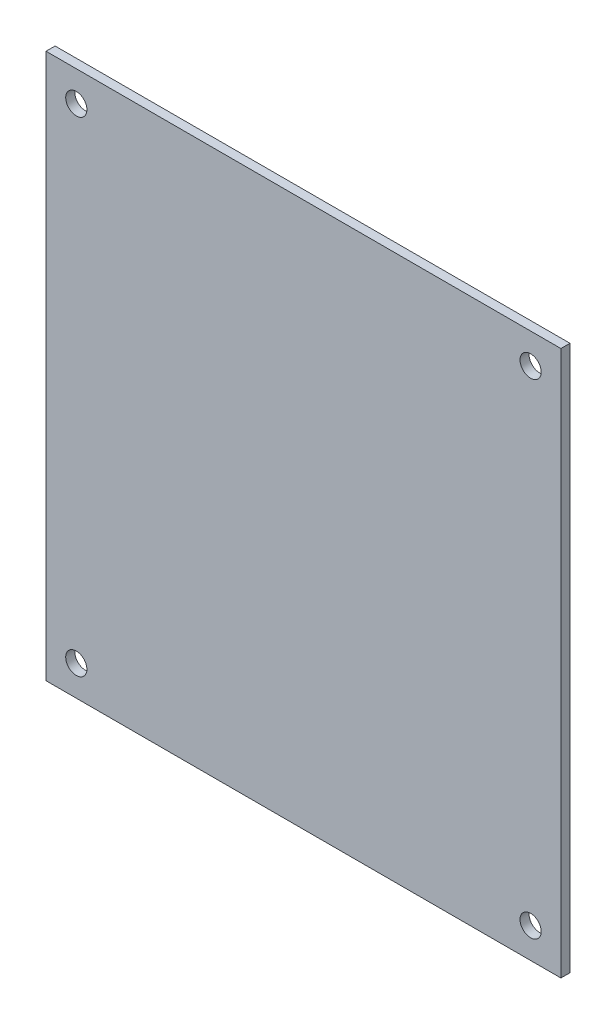
ISO-10303-21;
HEADER;
FILE_DESCRIPTION(('STEP AP214'),'2;1');
FILE_NAME('part.step','',(''),(''),'','','');
FILE_SCHEMA(('AUTOMOTIVE_DESIGN { 1 0 10303 214 1 1 1 1 }'));
ENDSEC;
DATA;
#1=APPLICATION_CONTEXT('core data for automotive mechanical design processes');
#2=APPLICATION_PROTOCOL_DEFINITION('international standard','automotive_design',2000,#1);
#3=PRODUCT_CONTEXT('',#1,'mechanical');
#4=PRODUCT('Part','Part','',(#3));
#5=PRODUCT_RELATED_PRODUCT_CATEGORY('part','',(#4));
#6=PRODUCT_DEFINITION_FORMATION('','',#4);
#7=PRODUCT_DEFINITION_CONTEXT('part definition',#1,'design');
#8=PRODUCT_DEFINITION('design','',#6,#7);
#9=PRODUCT_DEFINITION_SHAPE('','',#8);
#10=(LENGTH_UNIT() NAMED_UNIT(*) SI_UNIT(.MILLI.,.METRE.));
#11=(NAMED_UNIT(*) PLANE_ANGLE_UNIT() SI_UNIT($,.RADIAN.));
#12=(NAMED_UNIT(*) SI_UNIT($,.STERADIAN.) SOLID_ANGLE_UNIT());
#13=UNCERTAINTY_MEASURE_WITH_UNIT(LENGTH_MEASURE(1.E-05),#10,'distance_accuracy_value','');
#14=(GEOMETRIC_REPRESENTATION_CONTEXT(3) GLOBAL_UNCERTAINTY_ASSIGNED_CONTEXT((#13)) GLOBAL_UNIT_ASSIGNED_CONTEXT((#10,
#11,#12)) REPRESENTATION_CONTEXT('',''));
#15=CARTESIAN_POINT('',(0.,0.,0.));
#16=DIRECTION('',(0.,0.,1.));
#17=DIRECTION('',(1.,0.,0.));
#18=AXIS2_PLACEMENT_3D('',#15,#16,#17);
#19=CARTESIAN_POINT('',(0.,-45.,1.5));
#20=DIRECTION('',(0.,1.,0.));
#21=DIRECTION('',(0.,0.,1.));
#22=AXIS2_PLACEMENT_3D('',#19,#20,#21);
#23=PLANE('',#22);
#24=DIRECTION('',(1.,0.,0.));
#25=VECTOR('',#24,1.);
#26=CARTESIAN_POINT('',(0.,-45.,0.));
#27=LINE('',#26,#25);
#28=CARTESIAN_POINT('',(-42.5,-45.,0.));
#29=VERTEX_POINT('',#28);
#30=CARTESIAN_POINT('',(42.5,-45.,0.));
#31=VERTEX_POINT('',#30);
#32=EDGE_CURVE('E113',#29,#31,#27,.T.);
#33=ORIENTED_EDGE('',*,*,#32,.T.);
#34=DIRECTION('',(0.,0.,-1.));
#35=VECTOR('',#34,1.);
#36=CARTESIAN_POINT('',(42.5,-45.,1.5));
#37=LINE('',#36,#35);
#38=CARTESIAN_POINT('',(42.5,-45.,1.5));
#39=VERTEX_POINT('',#38);
#40=EDGE_CURVE('E11',#39,#31,#37,.T.);
#41=ORIENTED_EDGE('',*,*,#40,.F.);
#42=DIRECTION('',(1.,0.,0.));
#43=VECTOR('',#42,1.);
#44=CARTESIAN_POINT('',(0.,-45.,1.5));
#45=LINE('',#44,#43);
#46=CARTESIAN_POINT('',(-42.5,-45.,1.5));
#47=VERTEX_POINT('',#46);
#48=EDGE_CURVE('E87',#47,#39,#45,.T.);
#49=ORIENTED_EDGE('',*,*,#48,.F.);
#50=DIRECTION('',(0.,0.,-1.));
#51=VECTOR('',#50,1.);
#52=CARTESIAN_POINT('',(-42.5,-45.,1.5));
#53=LINE('',#52,#51);
#54=EDGE_CURVE('E54',#47,#29,#53,.T.);
#55=ORIENTED_EDGE('',*,*,#54,.T.);
#56=EDGE_LOOP('',(#33,#41,#49,#55));
#57=FACE_BOUND('',#56,.T.);
#58=ADVANCED_FACE('F37',(#57),#23,.F.);
#59=CARTESIAN_POINT('',(42.5,0.,1.5));
#60=DIRECTION('',(-1.,0.,0.));
#61=DIRECTION('',(0.,0.,1.));
#62=AXIS2_PLACEMENT_3D('',#59,#60,#61);
#63=PLANE('',#62);
#64=DIRECTION('',(0.,1.,0.));
#65=VECTOR('',#64,1.);
#66=CARTESIAN_POINT('',(42.5,0.,0.));
#67=LINE('',#66,#65);
#68=CARTESIAN_POINT('',(42.5,45.,0.));
#69=VERTEX_POINT('',#68);
#70=EDGE_CURVE('E92',#31,#69,#67,.T.);
#71=ORIENTED_EDGE('',*,*,#70,.T.);
#72=DIRECTION('',(0.,0.,-1.));
#73=VECTOR('',#72,1.);
#74=CARTESIAN_POINT('',(42.5,45.,1.5));
#75=LINE('',#74,#73);
#76=CARTESIAN_POINT('',(42.5,45.,1.5));
#77=VERTEX_POINT('',#76);
#78=EDGE_CURVE('E46',#77,#69,#75,.T.);
#79=ORIENTED_EDGE('',*,*,#78,.F.);
#80=DIRECTION('',(0.,1.,0.));
#81=VECTOR('',#80,1.);
#82=CARTESIAN_POINT('',(42.5,0.,1.5));
#83=LINE('',#82,#81);
#84=EDGE_CURVE('E79',#39,#77,#83,.T.);
#85=ORIENTED_EDGE('',*,*,#84,.F.);
#86=ORIENTED_EDGE('',*,*,#40,.T.);
#87=EDGE_LOOP('',(#71,#79,#85,#86));
#88=FACE_BOUND('',#87,.T.);
#89=ADVANCED_FACE('F91',(#88),#63,.F.);
#90=CARTESIAN_POINT('',(0.,45.,1.5));
#91=DIRECTION('',(0.,1.,0.));
#92=DIRECTION('',(0.,0.,1.));
#93=AXIS2_PLACEMENT_3D('',#90,#91,#92);
#94=PLANE('',#93);
#95=DIRECTION('',(1.,0.,0.));
#96=VECTOR('',#95,1.);
#97=CARTESIAN_POINT('',(0.,45.,0.));
#98=LINE('',#97,#96);
#99=CARTESIAN_POINT('',(-42.5,45.,0.));
#100=VERTEX_POINT('',#99);
#101=EDGE_CURVE('E116',#100,#69,#98,.T.);
#102=ORIENTED_EDGE('',*,*,#101,.F.);
#103=DIRECTION('',(0.,0.,-1.));
#104=VECTOR('',#103,1.);
#105=CARTESIAN_POINT('',(-42.5,45.,1.5));
#106=LINE('',#105,#104);
#107=CARTESIAN_POINT('',(-42.5,45.,1.5));
#108=VERTEX_POINT('',#107);
#109=EDGE_CURVE('E68',#108,#100,#106,.T.);
#110=ORIENTED_EDGE('',*,*,#109,.F.);
#111=DIRECTION('',(1.,0.,0.));
#112=VECTOR('',#111,1.);
#113=CARTESIAN_POINT('',(0.,45.,1.5));
#114=LINE('',#113,#112);
#115=EDGE_CURVE('E86',#108,#77,#114,.T.);
#116=ORIENTED_EDGE('',*,*,#115,.T.);
#117=ORIENTED_EDGE('',*,*,#78,.T.);
#118=EDGE_LOOP('',(#102,#110,#116,#117));
#119=FACE_BOUND('',#118,.T.);
#120=ADVANCED_FACE('F95',(#119),#94,.T.);
#121=CARTESIAN_POINT('',(-37.5,40.,1.5));
#122=DIRECTION('',(0.,0.,-1.));
#123=DIRECTION('',(-1.,0.,0.));
#124=AXIS2_PLACEMENT_3D('',#121,#122,#123);
#125=CYLINDRICAL_SURFACE('',#124,1.75);
#126=CARTESIAN_POINT('',(-37.5,40.,1.5));
#127=DIRECTION('',(0.,0.,1.));
#128=DIRECTION('',(1.,0.,0.));
#129=AXIS2_PLACEMENT_3D('',#126,#127,#128);
#130=CIRCLE('',#129,1.75);
#131=CARTESIAN_POINT('',(-35.75,40.,1.5));
#132=VERTEX_POINT('',#131);
#133=EDGE_CURVE('E135',#132,#132,#130,.T.);
#134=ORIENTED_EDGE('',*,*,#133,.T.);
#135=EDGE_LOOP('',(#134));
#136=FACE_BOUND('',#135,.T.);
#137=CARTESIAN_POINT('',(-37.5,40.,0.));
#138=DIRECTION('',(0.,0.,1.));
#139=DIRECTION('',(1.,0.,0.));
#140=AXIS2_PLACEMENT_3D('',#137,#138,#139);
#141=CIRCLE('',#140,1.75);
#142=CARTESIAN_POINT('',(-35.75,40.,0.));
#143=VERTEX_POINT('',#142);
#144=EDGE_CURVE('E110',#143,#143,#141,.T.);
#145=ORIENTED_EDGE('',*,*,#144,.F.);
#146=EDGE_LOOP('',(#145));
#147=FACE_BOUND('',#146,.T.);
#148=ADVANCED_FACE('F139',(#136,#147),#125,.F.);
#149=CARTESIAN_POINT('',(37.5,40.,1.5));
#150=DIRECTION('',(0.,0.,-1.));
#151=DIRECTION('',(-1.,0.,0.));
#152=AXIS2_PLACEMENT_3D('',#149,#150,#151);
#153=CYLINDRICAL_SURFACE('',#152,1.75000000000001);
#154=CARTESIAN_POINT('',(37.5,40.,1.5));
#155=DIRECTION('',(0.,0.,1.));
#156=DIRECTION('',(1.,0.,0.));
#157=AXIS2_PLACEMENT_3D('',#154,#155,#156);
#158=CIRCLE('',#157,1.75000000000001);
#159=CARTESIAN_POINT('',(39.25,40.,1.5));
#160=VERTEX_POINT('',#159);
#161=EDGE_CURVE('E130',#160,#160,#158,.T.);
#162=ORIENTED_EDGE('',*,*,#161,.T.);
#163=EDGE_LOOP('',(#162));
#164=FACE_BOUND('',#163,.T.);
#165=CARTESIAN_POINT('',(37.5,40.,0.));
#166=DIRECTION('',(0.,0.,1.));
#167=DIRECTION('',(1.,0.,0.));
#168=AXIS2_PLACEMENT_3D('',#165,#166,#167);
#169=CIRCLE('',#168,1.75000000000001);
#170=CARTESIAN_POINT('',(39.25,40.,0.));
#171=VERTEX_POINT('',#170);
#172=EDGE_CURVE('E107',#171,#171,#169,.T.);
#173=ORIENTED_EDGE('',*,*,#172,.F.);
#174=EDGE_LOOP('',(#173));
#175=FACE_BOUND('',#174,.T.);
#176=ADVANCED_FACE('F165',(#164,#175),#153,.F.);
#177=CARTESIAN_POINT('',(37.5,-40.,1.5));
#178=DIRECTION('',(0.,0.,-1.));
#179=DIRECTION('',(-1.,0.,0.));
#180=AXIS2_PLACEMENT_3D('',#177,#178,#179);
#181=CYLINDRICAL_SURFACE('',#180,1.75000000000001);
#182=CARTESIAN_POINT('',(37.5,-40.,1.5));
#183=DIRECTION('',(0.,0.,1.));
#184=DIRECTION('',(1.,0.,0.));
#185=AXIS2_PLACEMENT_3D('',#182,#183,#184);
#186=CIRCLE('',#185,1.75000000000001);
#187=CARTESIAN_POINT('',(39.25,-40.,1.5));
#188=VERTEX_POINT('',#187);
#189=EDGE_CURVE('E125',#188,#188,#186,.T.);
#190=ORIENTED_EDGE('',*,*,#189,.T.);
#191=EDGE_LOOP('',(#190));
#192=FACE_BOUND('',#191,.T.);
#193=CARTESIAN_POINT('',(37.5,-40.,0.));
#194=DIRECTION('',(0.,0.,1.));
#195=DIRECTION('',(1.,0.,0.));
#196=AXIS2_PLACEMENT_3D('',#193,#194,#195);
#197=CIRCLE('',#196,1.75000000000001);
#198=CARTESIAN_POINT('',(39.25,-40.,0.));
#199=VERTEX_POINT('',#198);
#200=EDGE_CURVE('E104',#199,#199,#197,.T.);
#201=ORIENTED_EDGE('',*,*,#200,.F.);
#202=EDGE_LOOP('',(#201));
#203=FACE_BOUND('',#202,.T.);
#204=ADVANCED_FACE('F167',(#192,#203),#181,.F.);
#205=CARTESIAN_POINT('',(-37.5,-40.,1.5));
#206=DIRECTION('',(0.,0.,-1.));
#207=DIRECTION('',(-1.,0.,0.));
#208=AXIS2_PLACEMENT_3D('',#205,#206,#207);
#209=CYLINDRICAL_SURFACE('',#208,1.75);
#210=CARTESIAN_POINT('',(-37.5,-40.,1.5));
#211=DIRECTION('',(0.,0.,1.));
#212=DIRECTION('',(1.,0.,0.));
#213=AXIS2_PLACEMENT_3D('',#210,#211,#212);
#214=CIRCLE('',#213,1.75);
#215=CARTESIAN_POINT('',(-35.75,-40.,1.5));
#216=VERTEX_POINT('',#215);
#217=EDGE_CURVE('E121',#216,#216,#214,.T.);
#218=ORIENTED_EDGE('',*,*,#217,.T.);
#219=EDGE_LOOP('',(#218));
#220=FACE_BOUND('',#219,.T.);
#221=CARTESIAN_POINT('',(-37.5,-40.,0.));
#222=DIRECTION('',(0.,0.,1.));
#223=DIRECTION('',(1.,0.,0.));
#224=AXIS2_PLACEMENT_3D('',#221,#222,#223);
#225=CIRCLE('',#224,1.75);
#226=CARTESIAN_POINT('',(-35.75,-40.,0.));
#227=VERTEX_POINT('',#226);
#228=EDGE_CURVE('E101',#227,#227,#225,.T.);
#229=ORIENTED_EDGE('',*,*,#228,.F.);
#230=EDGE_LOOP('',(#229));
#231=FACE_BOUND('',#230,.T.);
#232=ADVANCED_FACE('F39',(#220,#231),#209,.F.);
#233=CARTESIAN_POINT('',(-42.5,0.,1.5));
#234=DIRECTION('',(-1.,0.,0.));
#235=DIRECTION('',(0.,0.,1.));
#236=AXIS2_PLACEMENT_3D('',#233,#234,#235);
#237=PLANE('',#236);
#238=DIRECTION('',(0.,1.,0.));
#239=VECTOR('',#238,1.);
#240=CARTESIAN_POINT('',(-42.5,0.,0.));
#241=LINE('',#240,#239);
#242=EDGE_CURVE('E118',#29,#100,#241,.T.);
#243=ORIENTED_EDGE('',*,*,#242,.F.);
#244=ORIENTED_EDGE('',*,*,#54,.F.);
#245=DIRECTION('',(0.,1.,0.));
#246=VECTOR('',#245,1.);
#247=CARTESIAN_POINT('',(-42.5,0.,1.5));
#248=LINE('',#247,#246);
#249=EDGE_CURVE('E96',#47,#108,#248,.T.);
#250=ORIENTED_EDGE('',*,*,#249,.T.);
#251=ORIENTED_EDGE('',*,*,#109,.T.);
#252=EDGE_LOOP('',(#243,#244,#250,#251));
#253=FACE_BOUND('',#252,.T.);
#254=ADVANCED_FACE('F144',(#253),#237,.T.);
#255=CARTESIAN_POINT('',(0.,0.,1.5));
#256=DIRECTION('',(0.,0.,1.));
#257=DIRECTION('',(1.,0.,0.));
#258=AXIS2_PLACEMENT_3D('',#255,#256,#257);
#259=PLANE('',#258);
#260=ORIENTED_EDGE('',*,*,#217,.F.);
#261=EDGE_LOOP('',(#260));
#262=FACE_BOUND('',#261,.T.);
#263=ORIENTED_EDGE('',*,*,#189,.F.);
#264=EDGE_LOOP('',(#263));
#265=FACE_BOUND('',#264,.T.);
#266=ORIENTED_EDGE('',*,*,#161,.F.);
#267=EDGE_LOOP('',(#266));
#268=FACE_BOUND('',#267,.T.);
#269=ORIENTED_EDGE('',*,*,#133,.F.);
#270=EDGE_LOOP('',(#269));
#271=FACE_BOUND('',#270,.T.);
#272=ORIENTED_EDGE('',*,*,#48,.T.);
#273=ORIENTED_EDGE('',*,*,#84,.T.);
#274=ORIENTED_EDGE('',*,*,#115,.F.);
#275=ORIENTED_EDGE('',*,*,#249,.F.);
#276=EDGE_LOOP('',(#272,#273,#274,#275));
#277=FACE_BOUND('',#276,.T.);
#278=ADVANCED_FACE('F83',(#262,#265,#268,#271,#277),#259,.T.);
#279=CARTESIAN_POINT('',(0.,0.,0.));
#280=DIRECTION('',(0.,0.,1.));
#281=DIRECTION('',(1.,0.,0.));
#282=AXIS2_PLACEMENT_3D('',#279,#280,#281);
#283=PLANE('',#282);
#284=ORIENTED_EDGE('',*,*,#228,.T.);
#285=EDGE_LOOP('',(#284));
#286=FACE_BOUND('',#285,.T.);
#287=ORIENTED_EDGE('',*,*,#200,.T.);
#288=EDGE_LOOP('',(#287));
#289=FACE_BOUND('',#288,.T.);
#290=ORIENTED_EDGE('',*,*,#172,.T.);
#291=EDGE_LOOP('',(#290));
#292=FACE_BOUND('',#291,.T.);
#293=ORIENTED_EDGE('',*,*,#144,.T.);
#294=EDGE_LOOP('',(#293));
#295=FACE_BOUND('',#294,.T.);
#296=ORIENTED_EDGE('',*,*,#32,.F.);
#297=ORIENTED_EDGE('',*,*,#242,.T.);
#298=ORIENTED_EDGE('',*,*,#101,.T.);
#299=ORIENTED_EDGE('',*,*,#70,.F.);
#300=EDGE_LOOP('',(#296,#297,#298,#299));
#301=FACE_BOUND('',#300,.T.);
#302=ADVANCED_FACE('F143',(#286,#289,#292,#295,#301),#283,.F.);
#303=CLOSED_SHELL('',(#58,#89,#120,#148,#176,#204,#232,#254,#278,#302));
#304=MANIFOLD_SOLID_BREP('B2',#303);
#305=ADVANCED_BREP_SHAPE_REPRESENTATION('',(#18,#304),#14);
#306=SHAPE_DEFINITION_REPRESENTATION(#9,#305);
ENDSEC;
END-ISO-10303-21;
